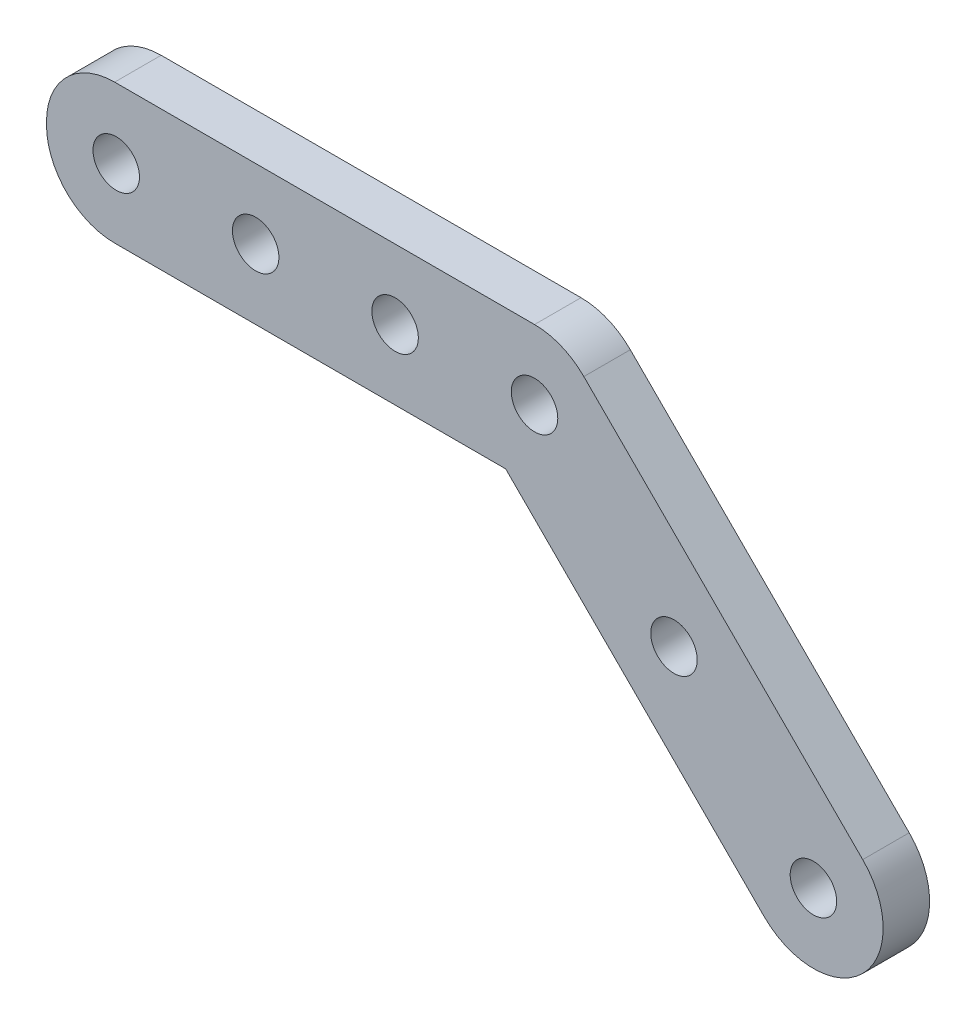
ISO-10303-21;
HEADER;
FILE_DESCRIPTION(('STEP AP214'),'2;1');
FILE_NAME('part.step','',(''),(''),'','','');
FILE_SCHEMA(('AUTOMOTIVE_DESIGN { 1 0 10303 214 1 1 1 1 }'));
ENDSEC;
DATA;
#1=APPLICATION_CONTEXT('core data for automotive mechanical design processes');
#2=APPLICATION_PROTOCOL_DEFINITION('international standard','automotive_design',2000,#1);
#3=PRODUCT_CONTEXT('',#1,'mechanical');
#4=PRODUCT('Part','Part','',(#3));
#5=PRODUCT_RELATED_PRODUCT_CATEGORY('part','',(#4));
#6=PRODUCT_DEFINITION_FORMATION('','',#4);
#7=PRODUCT_DEFINITION_CONTEXT('part definition',#1,'design');
#8=PRODUCT_DEFINITION('design','',#6,#7);
#9=PRODUCT_DEFINITION_SHAPE('','',#8);
#10=(LENGTH_UNIT() NAMED_UNIT(*) SI_UNIT(.MILLI.,.METRE.));
#11=(NAMED_UNIT(*) PLANE_ANGLE_UNIT() SI_UNIT($,.RADIAN.));
#12=(NAMED_UNIT(*) SI_UNIT($,.STERADIAN.) SOLID_ANGLE_UNIT());
#13=UNCERTAINTY_MEASURE_WITH_UNIT(LENGTH_MEASURE(1.E-05),#10,'distance_accuracy_value','');
#14=(GEOMETRIC_REPRESENTATION_CONTEXT(3) GLOBAL_UNCERTAINTY_ASSIGNED_CONTEXT((#13)) GLOBAL_UNIT_ASSIGNED_CONTEXT((#10,
#11,#12)) REPRESENTATION_CONTEXT('',''));
#15=CARTESIAN_POINT('',(0.,0.,0.));
#16=DIRECTION('',(0.,0.,1.));
#17=DIRECTION('',(1.,0.,0.));
#18=AXIS2_PLACEMENT_3D('',#15,#16,#17);
#19=CARTESIAN_POINT('',(165.7014682919,250.5562552893,3.));
#20=DIRECTION('',(0.,0.,1.));
#21=DIRECTION('',(1.,0.,0.));
#22=AXIS2_PLACEMENT_3D('',#19,#20,#21);
#23=PLANE('',#22);
#24=CARTESIAN_POINT('',(165.7014682919,250.5562552893,3.));
#25=DIRECTION('',(0.,0.,1.));
#26=DIRECTION('',(1.,0.,0.));
#27=AXIS2_PLACEMENT_3D('',#24,#25,#26);
#28=CIRCLE('',#27,1.5);
#29=CARTESIAN_POINT('',(167.2014682919,250.5562552893,3.));
#30=VERTEX_POINT('',#29);
#31=EDGE_CURVE('E215',#30,#30,#28,.T.);
#32=ORIENTED_EDGE('',*,*,#31,.F.);
#33=EDGE_LOOP('',(#32));
#34=FACE_BOUND('',#33,.T.);
#35=CARTESIAN_POINT('',(120.7014682919,268.5562552893,3.));
#36=DIRECTION('',(0.,0.,1.));
#37=DIRECTION('',(1.,0.,0.));
#38=AXIS2_PLACEMENT_3D('',#35,#36,#37);
#39=CIRCLE('',#38,1.5);
#40=CARTESIAN_POINT('',(122.2014682919,268.5562552893,3.));
#41=VERTEX_POINT('',#40);
#42=EDGE_CURVE('E203',#41,#41,#39,.T.);
#43=ORIENTED_EDGE('',*,*,#42,.F.);
#44=EDGE_LOOP('',(#43));
#45=FACE_BOUND('',#44,.T.);
#46=CARTESIAN_POINT('',(129.7014682919,268.5562552893,3.));
#47=DIRECTION('',(0.,0.,1.));
#48=DIRECTION('',(1.,0.,0.));
#49=AXIS2_PLACEMENT_3D('',#46,#47,#48);
#50=CIRCLE('',#49,1.5);
#51=CARTESIAN_POINT('',(131.2014682919,268.5562552893,3.));
#52=VERTEX_POINT('',#51);
#53=EDGE_CURVE('E139',#52,#52,#50,.T.);
#54=ORIENTED_EDGE('',*,*,#53,.F.);
#55=EDGE_LOOP('',(#54));
#56=FACE_BOUND('',#55,.T.);
#57=CARTESIAN_POINT('',(165.7014682919,250.5562552893,3.));
#58=DIRECTION('',(0.,0.,1.));
#59=DIRECTION('',(1.,0.,0.));
#60=AXIS2_PLACEMENT_3D('',#57,#58,#59);
#61=CIRCLE('',#60,4.50000000001491);
#62=CARTESIAN_POINT('',(162.5194877765,247.374274774,3.));
#63=VERTEX_POINT('',#62);
#64=CARTESIAN_POINT('',(168.8834488072,253.7382358047,3.));
#65=VERTEX_POINT('',#64);
#66=EDGE_CURVE('E152',#63,#65,#61,.T.);
#67=ORIENTED_EDGE('',*,*,#66,.T.);
#68=DIRECTION('',(-0.707106781186548,0.707106781186548,0.));
#69=VECTOR('',#68,1.);
#70=CARTESIAN_POINT('',(168.8834488072,253.7382358047,3.));
#71=LINE('',#70,#69);
#72=CARTESIAN_POINT('',(150.883448807195,271.738235804695,3.));
#73=VERTEX_POINT('',#72);
#74=EDGE_CURVE('E95',#65,#73,#71,.T.);
#75=ORIENTED_EDGE('',*,*,#74,.T.);
#76=CARTESIAN_POINT('',(147.7014682919,268.5562552893,3.));
#77=DIRECTION('',(0.,0.,1.));
#78=DIRECTION('',(1.,0.,0.));
#79=AXIS2_PLACEMENT_3D('',#76,#77,#78);
#80=CIRCLE('',#79,4.50000000000746);
#81=CARTESIAN_POINT('',(147.7014682919,273.0562552893,3.));
#82=VERTEX_POINT('',#81);
#83=EDGE_CURVE('E170',#73,#82,#80,.T.);
#84=ORIENTED_EDGE('',*,*,#83,.T.);
#85=DIRECTION('',(-1.,0.,0.));
#86=VECTOR('',#85,1.);
#87=CARTESIAN_POINT('',(147.7014682919,273.0562552893,3.));
#88=LINE('',#87,#86);
#89=CARTESIAN_POINT('',(120.6014682919,273.0562552893,3.));
#90=VERTEX_POINT('',#89);
#91=EDGE_CURVE('E187',#82,#90,#88,.T.);
#92=ORIENTED_EDGE('',*,*,#91,.T.);
#93=CARTESIAN_POINT('',(120.6014682919,268.6562552893,3.));
#94=DIRECTION('',(0.,0.,1.));
#95=DIRECTION('',(1.,0.,0.));
#96=AXIS2_PLACEMENT_3D('',#93,#94,#95);
#97=CIRCLE('',#96,4.40000000000007);
#98=CARTESIAN_POINT('',(116.2014682919,268.6562552893,3.));
#99=VERTEX_POINT('',#98);
#100=EDGE_CURVE('E186',#90,#99,#97,.T.);
#101=ORIENTED_EDGE('',*,*,#100,.T.);
#102=DIRECTION('',(0.,-1.,0.));
#103=VECTOR('',#102,1.);
#104=CARTESIAN_POINT('',(116.2014682919,268.6562552893,3.));
#105=LINE('',#104,#103);
#106=CARTESIAN_POINT('',(116.2014682919,268.4562552893,3.));
#107=VERTEX_POINT('',#106);
#108=EDGE_CURVE('E117',#99,#107,#105,.T.);
#109=ORIENTED_EDGE('',*,*,#108,.T.);
#110=CARTESIAN_POINT('',(120.6014682919,268.4562552893,3.));
#111=DIRECTION('',(0.,0.,1.));
#112=DIRECTION('',(1.,0.,0.));
#113=AXIS2_PLACEMENT_3D('',#110,#111,#112);
#114=CIRCLE('',#113,4.40000000000008);
#115=CARTESIAN_POINT('',(120.6014682919,264.0562552893,3.));
#116=VERTEX_POINT('',#115);
#117=EDGE_CURVE('E111',#107,#116,#114,.T.);
#118=ORIENTED_EDGE('',*,*,#117,.T.);
#119=DIRECTION('',(1.,0.,0.));
#120=VECTOR('',#119,1.);
#121=CARTESIAN_POINT('',(120.6014682919,264.0562552893,3.));
#122=LINE('',#121,#120);
#123=CARTESIAN_POINT('',(145.8375072612,264.0562552893,3.));
#124=VERTEX_POINT('',#123);
#125=EDGE_CURVE('E115',#116,#124,#122,.T.);
#126=ORIENTED_EDGE('',*,*,#125,.T.);
#127=DIRECTION('',(0.707106781186548,-0.707106781186547,0.));
#128=VECTOR('',#127,1.);
#129=CARTESIAN_POINT('',(145.8375072612,264.0562552893,3.));
#130=LINE('',#129,#128);
#131=EDGE_CURVE('E49',#124,#63,#130,.T.);
#132=ORIENTED_EDGE('',*,*,#131,.T.);
#133=EDGE_LOOP('',(#67,#75,#84,#92,#101,#109,#118,#126,#132));
#134=FACE_BOUND('',#133,.T.);
#135=CARTESIAN_POINT('',(138.7014682919,268.5562552893,3.));
#136=DIRECTION('',(0.,0.,1.));
#137=DIRECTION('',(1.,0.,0.));
#138=AXIS2_PLACEMENT_3D('',#135,#136,#137);
#139=CIRCLE('',#138,1.5);
#140=CARTESIAN_POINT('',(140.2014682919,268.5562552893,3.));
#141=VERTEX_POINT('',#140);
#142=EDGE_CURVE('E197',#141,#141,#139,.T.);
#143=ORIENTED_EDGE('',*,*,#142,.F.);
#144=EDGE_LOOP('',(#143));
#145=FACE_BOUND('',#144,.T.);
#146=CARTESIAN_POINT('',(147.7014682919,268.5562552893,3.));
#147=DIRECTION('',(0.,0.,1.));
#148=DIRECTION('',(1.,0.,0.));
#149=AXIS2_PLACEMENT_3D('',#146,#147,#148);
#150=CIRCLE('',#149,1.5);
#151=CARTESIAN_POINT('',(149.2014682919,268.5562552893,3.));
#152=VERTEX_POINT('',#151);
#153=EDGE_CURVE('E209',#152,#152,#150,.T.);
#154=ORIENTED_EDGE('',*,*,#153,.F.);
#155=EDGE_LOOP('',(#154));
#156=FACE_BOUND('',#155,.T.);
#157=CARTESIAN_POINT('',(156.7014682919,259.5562552893,3.));
#158=DIRECTION('',(0.,0.,1.));
#159=DIRECTION('',(1.,0.,0.));
#160=AXIS2_PLACEMENT_3D('',#157,#158,#159);
#161=CIRCLE('',#160,1.5);
#162=CARTESIAN_POINT('',(158.2014682919,259.5562552893,3.));
#163=VERTEX_POINT('',#162);
#164=EDGE_CURVE('E221',#163,#163,#161,.T.);
#165=ORIENTED_EDGE('',*,*,#164,.F.);
#166=EDGE_LOOP('',(#165));
#167=FACE_BOUND('',#166,.T.);
#168=ADVANCED_FACE('F32',(#34,#45,#56,#134,#145,#156,#167),#23,.T.);
#169=CARTESIAN_POINT('',(165.7014682919,250.5562552893,0.));
#170=DIRECTION('',(0.,0.,1.));
#171=DIRECTION('',(1.,0.,0.));
#172=AXIS2_PLACEMENT_3D('',#169,#170,#171);
#173=PLANE('',#172);
#174=CARTESIAN_POINT('',(165.7014682919,250.5562552893,0.));
#175=DIRECTION('',(0.,0.,1.));
#176=DIRECTION('',(1.,0.,0.));
#177=AXIS2_PLACEMENT_3D('',#174,#175,#176);
#178=CIRCLE('',#177,1.5);
#179=CARTESIAN_POINT('',(167.2014682919,250.5562552893,0.));
#180=VERTEX_POINT('',#179);
#181=EDGE_CURVE('E218',#180,#180,#178,.T.);
#182=ORIENTED_EDGE('',*,*,#181,.T.);
#183=EDGE_LOOP('',(#182));
#184=FACE_BOUND('',#183,.T.);
#185=CARTESIAN_POINT('',(120.7014682919,268.5562552893,0.));
#186=DIRECTION('',(0.,0.,1.));
#187=DIRECTION('',(1.,0.,0.));
#188=AXIS2_PLACEMENT_3D('',#185,#186,#187);
#189=CIRCLE('',#188,1.5);
#190=CARTESIAN_POINT('',(122.2014682919,268.5562552893,0.));
#191=VERTEX_POINT('',#190);
#192=EDGE_CURVE('E206',#191,#191,#189,.T.);
#193=ORIENTED_EDGE('',*,*,#192,.T.);
#194=EDGE_LOOP('',(#193));
#195=FACE_BOUND('',#194,.T.);
#196=CARTESIAN_POINT('',(129.7014682919,268.5562552893,0.));
#197=DIRECTION('',(0.,0.,1.));
#198=DIRECTION('',(1.,0.,0.));
#199=AXIS2_PLACEMENT_3D('',#196,#197,#198);
#200=CIRCLE('',#199,1.5);
#201=CARTESIAN_POINT('',(131.2014682919,268.5562552893,0.));
#202=VERTEX_POINT('',#201);
#203=EDGE_CURVE('E194',#202,#202,#200,.T.);
#204=ORIENTED_EDGE('',*,*,#203,.T.);
#205=EDGE_LOOP('',(#204));
#206=FACE_BOUND('',#205,.T.);
#207=CARTESIAN_POINT('',(165.7014682919,250.5562552893,0.));
#208=DIRECTION('',(0.,0.,1.));
#209=DIRECTION('',(1.,0.,0.));
#210=AXIS2_PLACEMENT_3D('',#207,#208,#209);
#211=CIRCLE('',#210,4.50000000001491);
#212=CARTESIAN_POINT('',(162.5194877765,247.374274774,0.));
#213=VERTEX_POINT('',#212);
#214=CARTESIAN_POINT('',(168.8834488072,253.7382358047,0.));
#215=VERTEX_POINT('',#214);
#216=EDGE_CURVE('E135',#213,#215,#211,.T.);
#217=ORIENTED_EDGE('',*,*,#216,.F.);
#218=DIRECTION('',(0.707106781186548,-0.707106781186547,0.));
#219=VECTOR('',#218,1.);
#220=CARTESIAN_POINT('',(145.8375072612,264.0562552893,0.));
#221=LINE('',#220,#219);
#222=CARTESIAN_POINT('',(145.8375072612,264.0562552893,0.));
#223=VERTEX_POINT('',#222);
#224=EDGE_CURVE('E87',#223,#213,#221,.T.);
#225=ORIENTED_EDGE('',*,*,#224,.F.);
#226=DIRECTION('',(1.,0.,0.));
#227=VECTOR('',#226,1.);
#228=CARTESIAN_POINT('',(120.6014682919,264.0562552893,0.));
#229=LINE('',#228,#227);
#230=CARTESIAN_POINT('',(120.6014682919,264.0562552893,0.));
#231=VERTEX_POINT('',#230);
#232=EDGE_CURVE('E81',#231,#223,#229,.T.);
#233=ORIENTED_EDGE('',*,*,#232,.F.);
#234=CARTESIAN_POINT('',(120.6014682919,268.4562552893,0.));
#235=DIRECTION('',(0.,0.,1.));
#236=DIRECTION('',(1.,0.,0.));
#237=AXIS2_PLACEMENT_3D('',#234,#235,#236);
#238=CIRCLE('',#237,4.40000000000008);
#239=CARTESIAN_POINT('',(116.2014682919,268.4562552893,0.));
#240=VERTEX_POINT('',#239);
#241=EDGE_CURVE('E125',#240,#231,#238,.T.);
#242=ORIENTED_EDGE('',*,*,#241,.F.);
#243=DIRECTION('',(0.,-1.,0.));
#244=VECTOR('',#243,1.);
#245=CARTESIAN_POINT('',(116.2014682919,268.6562552893,0.));
#246=LINE('',#245,#244);
#247=CARTESIAN_POINT('',(116.2014682919,268.6562552893,0.));
#248=VERTEX_POINT('',#247);
#249=EDGE_CURVE('E147',#248,#240,#246,.T.);
#250=ORIENTED_EDGE('',*,*,#249,.F.);
#251=CARTESIAN_POINT('',(120.6014682919,268.6562552893,0.));
#252=DIRECTION('',(0.,0.,1.));
#253=DIRECTION('',(1.,0.,0.));
#254=AXIS2_PLACEMENT_3D('',#251,#252,#253);
#255=CIRCLE('',#254,4.40000000000007);
#256=CARTESIAN_POINT('',(120.6014682919,273.0562552893,0.));
#257=VERTEX_POINT('',#256);
#258=EDGE_CURVE('E145',#257,#248,#255,.T.);
#259=ORIENTED_EDGE('',*,*,#258,.F.);
#260=DIRECTION('',(-1.,0.,0.));
#261=VECTOR('',#260,1.);
#262=CARTESIAN_POINT('',(147.7014682919,273.0562552893,0.));
#263=LINE('',#262,#261);
#264=CARTESIAN_POINT('',(147.7014682919,273.0562552893,0.));
#265=VERTEX_POINT('',#264);
#266=EDGE_CURVE('E143',#265,#257,#263,.T.);
#267=ORIENTED_EDGE('',*,*,#266,.F.);
#268=CARTESIAN_POINT('',(147.7014682919,268.5562552893,0.));
#269=DIRECTION('',(0.,0.,1.));
#270=DIRECTION('',(1.,0.,0.));
#271=AXIS2_PLACEMENT_3D('',#268,#269,#270);
#272=CIRCLE('',#271,4.50000000000746);
#273=CARTESIAN_POINT('',(150.883448807195,271.738235804695,0.));
#274=VERTEX_POINT('',#273);
#275=EDGE_CURVE('E141',#274,#265,#272,.T.);
#276=ORIENTED_EDGE('',*,*,#275,.F.);
#277=DIRECTION('',(-0.707106781186548,0.707106781186548,0.));
#278=VECTOR('',#277,1.);
#279=CARTESIAN_POINT('',(168.8834488072,253.7382358047,0.));
#280=LINE('',#279,#278);
#281=EDGE_CURVE('E138',#215,#274,#280,.T.);
#282=ORIENTED_EDGE('',*,*,#281,.F.);
#283=EDGE_LOOP('',(#217,#225,#233,#242,#250,#259,#267,#276,#282));
#284=FACE_BOUND('',#283,.T.);
#285=CARTESIAN_POINT('',(138.7014682919,268.5562552893,0.));
#286=DIRECTION('',(0.,0.,1.));
#287=DIRECTION('',(1.,0.,0.));
#288=AXIS2_PLACEMENT_3D('',#285,#286,#287);
#289=CIRCLE('',#288,1.5);
#290=CARTESIAN_POINT('',(140.2014682919,268.5562552893,0.));
#291=VERTEX_POINT('',#290);
#292=EDGE_CURVE('E200',#291,#291,#289,.T.);
#293=ORIENTED_EDGE('',*,*,#292,.T.);
#294=EDGE_LOOP('',(#293));
#295=FACE_BOUND('',#294,.T.);
#296=CARTESIAN_POINT('',(147.7014682919,268.5562552893,0.));
#297=DIRECTION('',(0.,0.,1.));
#298=DIRECTION('',(1.,0.,0.));
#299=AXIS2_PLACEMENT_3D('',#296,#297,#298);
#300=CIRCLE('',#299,1.5);
#301=CARTESIAN_POINT('',(149.2014682919,268.5562552893,0.));
#302=VERTEX_POINT('',#301);
#303=EDGE_CURVE('E212',#302,#302,#300,.T.);
#304=ORIENTED_EDGE('',*,*,#303,.T.);
#305=EDGE_LOOP('',(#304));
#306=FACE_BOUND('',#305,.T.);
#307=CARTESIAN_POINT('',(156.7014682919,259.5562552893,0.));
#308=DIRECTION('',(0.,0.,1.));
#309=DIRECTION('',(1.,0.,0.));
#310=AXIS2_PLACEMENT_3D('',#307,#308,#309);
#311=CIRCLE('',#310,1.5);
#312=CARTESIAN_POINT('',(158.2014682919,259.5562552893,0.));
#313=VERTEX_POINT('',#312);
#314=EDGE_CURVE('E224',#313,#313,#311,.T.);
#315=ORIENTED_EDGE('',*,*,#314,.T.);
#316=EDGE_LOOP('',(#315));
#317=FACE_BOUND('',#316,.T.);
#318=ADVANCED_FACE('F174',(#184,#195,#206,#284,#295,#306,#317),#173,.F.);
#319=CARTESIAN_POINT('',(165.7014682919,250.5562552893,3.));
#320=DIRECTION('',(0.,0.,-1.));
#321=DIRECTION('',(-1.,0.,0.));
#322=AXIS2_PLACEMENT_3D('',#319,#320,#321);
#323=CYLINDRICAL_SURFACE('',#322,4.50000000001491);
#324=ORIENTED_EDGE('',*,*,#216,.T.);
#325=DIRECTION('',(0.,0.,-1.));
#326=VECTOR('',#325,1.);
#327=CARTESIAN_POINT('',(168.8834488072,253.7382358047,3.));
#328=LINE('',#327,#326);
#329=EDGE_CURVE('E11',#65,#215,#328,.T.);
#330=ORIENTED_EDGE('',*,*,#329,.F.);
#331=ORIENTED_EDGE('',*,*,#66,.F.);
#332=DIRECTION('',(0.,0.,-1.));
#333=VECTOR('',#332,1.);
#334=CARTESIAN_POINT('',(162.5194877765,247.374274774,3.));
#335=LINE('',#334,#333);
#336=EDGE_CURVE('E131',#63,#213,#335,.T.);
#337=ORIENTED_EDGE('',*,*,#336,.T.);
#338=EDGE_LOOP('',(#324,#330,#331,#337));
#339=FACE_BOUND('',#338,.T.);
#340=ADVANCED_FACE('F34',(#339),#323,.T.);
#341=CARTESIAN_POINT('',(168.8834488072,253.7382358047,3.));
#342=DIRECTION('',(-0.707106781186547,-0.707106781186547,0.));
#343=DIRECTION('',(0.707106781186548,-0.707106781186548,0.));
#344=AXIS2_PLACEMENT_3D('',#341,#342,#343);
#345=PLANE('',#344);
#346=ORIENTED_EDGE('',*,*,#281,.T.);
#347=DIRECTION('',(0.,0.,-1.));
#348=VECTOR('',#347,1.);
#349=CARTESIAN_POINT('',(150.883448807195,271.738235804695,3.));
#350=LINE('',#349,#348);
#351=EDGE_CURVE('E41',#73,#274,#350,.T.);
#352=ORIENTED_EDGE('',*,*,#351,.F.);
#353=ORIENTED_EDGE('',*,*,#74,.F.);
#354=ORIENTED_EDGE('',*,*,#329,.T.);
#355=EDGE_LOOP('',(#346,#352,#353,#354));
#356=FACE_BOUND('',#355,.T.);
#357=ADVANCED_FACE('F263',(#356),#345,.F.);
#358=CARTESIAN_POINT('',(147.7014682919,268.5562552893,3.));
#359=DIRECTION('',(0.,0.,-1.));
#360=DIRECTION('',(-1.,0.,0.));
#361=AXIS2_PLACEMENT_3D('',#358,#359,#360);
#362=CYLINDRICAL_SURFACE('',#361,4.50000000000746);
#363=ORIENTED_EDGE('',*,*,#275,.T.);
#364=DIRECTION('',(0.,0.,-1.));
#365=VECTOR('',#364,1.);
#366=CARTESIAN_POINT('',(147.7014682919,273.0562552893,3.));
#367=LINE('',#366,#365);
#368=EDGE_CURVE('E162',#82,#265,#367,.T.);
#369=ORIENTED_EDGE('',*,*,#368,.F.);
#370=ORIENTED_EDGE('',*,*,#83,.F.);
#371=ORIENTED_EDGE('',*,*,#351,.T.);
#372=EDGE_LOOP('',(#363,#369,#370,#371));
#373=FACE_BOUND('',#372,.T.);
#374=ADVANCED_FACE('F168',(#373),#362,.T.);
#375=CARTESIAN_POINT('',(147.7014682919,273.0562552893,3.));
#376=DIRECTION('',(0.,-1.,0.));
#377=DIRECTION('',(0.,0.,-1.));
#378=AXIS2_PLACEMENT_3D('',#375,#376,#377);
#379=PLANE('',#378);
#380=ORIENTED_EDGE('',*,*,#266,.T.);
#381=DIRECTION('',(0.,0.,-1.));
#382=VECTOR('',#381,1.);
#383=CARTESIAN_POINT('',(120.6014682919,273.0562552893,3.));
#384=LINE('',#383,#382);
#385=EDGE_CURVE('E159',#90,#257,#384,.T.);
#386=ORIENTED_EDGE('',*,*,#385,.F.);
#387=ORIENTED_EDGE('',*,*,#91,.F.);
#388=ORIENTED_EDGE('',*,*,#368,.T.);
#389=EDGE_LOOP('',(#380,#386,#387,#388));
#390=FACE_BOUND('',#389,.T.);
#391=ADVANCED_FACE('F180',(#390),#379,.F.);
#392=CARTESIAN_POINT('',(120.6014682919,268.6562552893,3.));
#393=DIRECTION('',(0.,0.,-1.));
#394=DIRECTION('',(-1.,0.,0.));
#395=AXIS2_PLACEMENT_3D('',#392,#393,#394);
#396=CYLINDRICAL_SURFACE('',#395,4.40000000000007);
#397=ORIENTED_EDGE('',*,*,#258,.T.);
#398=DIRECTION('',(0.,0.,-1.));
#399=VECTOR('',#398,1.);
#400=CARTESIAN_POINT('',(116.2014682919,268.6562552893,3.));
#401=LINE('',#400,#399);
#402=EDGE_CURVE('E156',#99,#248,#401,.T.);
#403=ORIENTED_EDGE('',*,*,#402,.F.);
#404=ORIENTED_EDGE('',*,*,#100,.F.);
#405=ORIENTED_EDGE('',*,*,#385,.T.);
#406=EDGE_LOOP('',(#397,#403,#404,#405));
#407=FACE_BOUND('',#406,.T.);
#408=ADVANCED_FACE('F184',(#407),#396,.T.);
#409=CARTESIAN_POINT('',(116.2014682919,268.6562552893,3.));
#410=DIRECTION('',(1.,0.,0.));
#411=DIRECTION('',(0.,0.,-1.));
#412=AXIS2_PLACEMENT_3D('',#409,#410,#411);
#413=PLANE('',#412);
#414=ORIENTED_EDGE('',*,*,#249,.T.);
#415=DIRECTION('',(0.,0.,-1.));
#416=VECTOR('',#415,1.);
#417=CARTESIAN_POINT('',(116.2014682919,268.4562552893,3.));
#418=LINE('',#417,#416);
#419=EDGE_CURVE('E126',#107,#240,#418,.T.);
#420=ORIENTED_EDGE('',*,*,#419,.F.);
#421=ORIENTED_EDGE('',*,*,#108,.F.);
#422=ORIENTED_EDGE('',*,*,#402,.T.);
#423=EDGE_LOOP('',(#414,#420,#421,#422));
#424=FACE_BOUND('',#423,.T.);
#425=ADVANCED_FACE('F254',(#424),#413,.F.);
#426=CARTESIAN_POINT('',(120.6014682919,268.4562552893,3.));
#427=DIRECTION('',(0.,0.,-1.));
#428=DIRECTION('',(-1.,0.,0.));
#429=AXIS2_PLACEMENT_3D('',#426,#427,#428);
#430=CYLINDRICAL_SURFACE('',#429,4.40000000000008);
#431=ORIENTED_EDGE('',*,*,#241,.T.);
#432=DIRECTION('',(0.,0.,-1.));
#433=VECTOR('',#432,1.);
#434=CARTESIAN_POINT('',(120.6014682919,264.0562552893,3.));
#435=LINE('',#434,#433);
#436=EDGE_CURVE('E122',#116,#231,#435,.T.);
#437=ORIENTED_EDGE('',*,*,#436,.F.);
#438=ORIENTED_EDGE('',*,*,#117,.F.);
#439=ORIENTED_EDGE('',*,*,#419,.T.);
#440=EDGE_LOOP('',(#431,#437,#438,#439));
#441=FACE_BOUND('',#440,.T.);
#442=ADVANCED_FACE('F123',(#441),#430,.T.);
#443=CARTESIAN_POINT('',(120.6014682919,264.0562552893,3.));
#444=DIRECTION('',(0.,1.,0.));
#445=DIRECTION('',(0.,0.,1.));
#446=AXIS2_PLACEMENT_3D('',#443,#444,#445);
#447=PLANE('',#446);
#448=ORIENTED_EDGE('',*,*,#232,.T.);
#449=DIRECTION('',(0.,0.,-1.));
#450=VECTOR('',#449,1.);
#451=CARTESIAN_POINT('',(145.8375072612,264.0562552893,3.));
#452=LINE('',#451,#450);
#453=EDGE_CURVE('E127',#124,#223,#452,.T.);
#454=ORIENTED_EDGE('',*,*,#453,.F.);
#455=ORIENTED_EDGE('',*,*,#125,.F.);
#456=ORIENTED_EDGE('',*,*,#436,.T.);
#457=EDGE_LOOP('',(#448,#454,#455,#456));
#458=FACE_BOUND('',#457,.T.);
#459=ADVANCED_FACE('F129',(#458),#447,.F.);
#460=CARTESIAN_POINT('',(145.8375072612,264.0562552893,3.));
#461=DIRECTION('',(0.707106781186547,0.707106781186548,0.));
#462=DIRECTION('',(-0.707106781186548,0.707106781186547,0.));
#463=AXIS2_PLACEMENT_3D('',#460,#461,#462);
#464=PLANE('',#463);
#465=ORIENTED_EDGE('',*,*,#224,.T.);
#466=ORIENTED_EDGE('',*,*,#336,.F.);
#467=ORIENTED_EDGE('',*,*,#131,.F.);
#468=ORIENTED_EDGE('',*,*,#453,.T.);
#469=EDGE_LOOP('',(#465,#466,#467,#468));
#470=FACE_BOUND('',#469,.T.);
#471=ADVANCED_FACE('F247',(#470),#464,.F.);
#472=CARTESIAN_POINT('',(129.7014682919,268.5562552893,3.));
#473=DIRECTION('',(0.,0.,-1.));
#474=DIRECTION('',(-1.,0.,0.));
#475=AXIS2_PLACEMENT_3D('',#472,#473,#474);
#476=CYLINDRICAL_SURFACE('',#475,1.5);
#477=ORIENTED_EDGE('',*,*,#53,.T.);
#478=EDGE_LOOP('',(#477));
#479=FACE_BOUND('',#478,.T.);
#480=ORIENTED_EDGE('',*,*,#203,.F.);
#481=EDGE_LOOP('',(#480));
#482=FACE_BOUND('',#481,.T.);
#483=ADVANCED_FACE('F244',(#479,#482),#476,.F.);
#484=CARTESIAN_POINT('',(138.7014682919,268.5562552893,3.));
#485=DIRECTION('',(0.,0.,-1.));
#486=DIRECTION('',(-1.,0.,0.));
#487=AXIS2_PLACEMENT_3D('',#484,#485,#486);
#488=CYLINDRICAL_SURFACE('',#487,1.5);
#489=ORIENTED_EDGE('',*,*,#142,.T.);
#490=EDGE_LOOP('',(#489));
#491=FACE_BOUND('',#490,.T.);
#492=ORIENTED_EDGE('',*,*,#292,.F.);
#493=EDGE_LOOP('',(#492));
#494=FACE_BOUND('',#493,.T.);
#495=ADVANCED_FACE('F332',(#491,#494),#488,.F.);
#496=CARTESIAN_POINT('',(120.7014682919,268.5562552893,3.));
#497=DIRECTION('',(0.,0.,-1.));
#498=DIRECTION('',(-1.,0.,0.));
#499=AXIS2_PLACEMENT_3D('',#496,#497,#498);
#500=CYLINDRICAL_SURFACE('',#499,1.5);
#501=ORIENTED_EDGE('',*,*,#42,.T.);
#502=EDGE_LOOP('',(#501));
#503=FACE_BOUND('',#502,.T.);
#504=ORIENTED_EDGE('',*,*,#192,.F.);
#505=EDGE_LOOP('',(#504));
#506=FACE_BOUND('',#505,.T.);
#507=ADVANCED_FACE('F340',(#503,#506),#500,.F.);
#508=CARTESIAN_POINT('',(147.7014682919,268.5562552893,3.));
#509=DIRECTION('',(0.,0.,-1.));
#510=DIRECTION('',(-1.,0.,0.));
#511=AXIS2_PLACEMENT_3D('',#508,#509,#510);
#512=CYLINDRICAL_SURFACE('',#511,1.5);
#513=ORIENTED_EDGE('',*,*,#153,.T.);
#514=EDGE_LOOP('',(#513));
#515=FACE_BOUND('',#514,.T.);
#516=ORIENTED_EDGE('',*,*,#303,.F.);
#517=EDGE_LOOP('',(#516));
#518=FACE_BOUND('',#517,.T.);
#519=ADVANCED_FACE('F348',(#515,#518),#512,.F.);
#520=CARTESIAN_POINT('',(165.7014682919,250.5562552893,3.));
#521=DIRECTION('',(0.,0.,-1.));
#522=DIRECTION('',(-1.,0.,0.));
#523=AXIS2_PLACEMENT_3D('',#520,#521,#522);
#524=CYLINDRICAL_SURFACE('',#523,1.5);
#525=ORIENTED_EDGE('',*,*,#31,.T.);
#526=EDGE_LOOP('',(#525));
#527=FACE_BOUND('',#526,.T.);
#528=ORIENTED_EDGE('',*,*,#181,.F.);
#529=EDGE_LOOP('',(#528));
#530=FACE_BOUND('',#529,.T.);
#531=ADVANCED_FACE('F357',(#527,#530),#524,.F.);
#532=CARTESIAN_POINT('',(156.7014682919,259.5562552893,3.));
#533=DIRECTION('',(0.,0.,-1.));
#534=DIRECTION('',(-1.,0.,0.));
#535=AXIS2_PLACEMENT_3D('',#532,#533,#534);
#536=CYLINDRICAL_SURFACE('',#535,1.5);
#537=ORIENTED_EDGE('',*,*,#164,.T.);
#538=EDGE_LOOP('',(#537));
#539=FACE_BOUND('',#538,.T.);
#540=ORIENTED_EDGE('',*,*,#314,.F.);
#541=EDGE_LOOP('',(#540));
#542=FACE_BOUND('',#541,.T.);
#543=ADVANCED_FACE('F230',(#539,#542),#536,.F.);
#544=CLOSED_SHELL('',(#168,#318,#340,#357,#374,#391,#408,#425,#442,#459,#471,#483,#495,#507,
#519,#531,#543));
#545=MANIFOLD_SOLID_BREP('B2',#544);
#546=ADVANCED_BREP_SHAPE_REPRESENTATION('',(#18,#545),#14);
#547=SHAPE_DEFINITION_REPRESENTATION(#9,#546);
ENDSEC;
END-ISO-10303-21;
